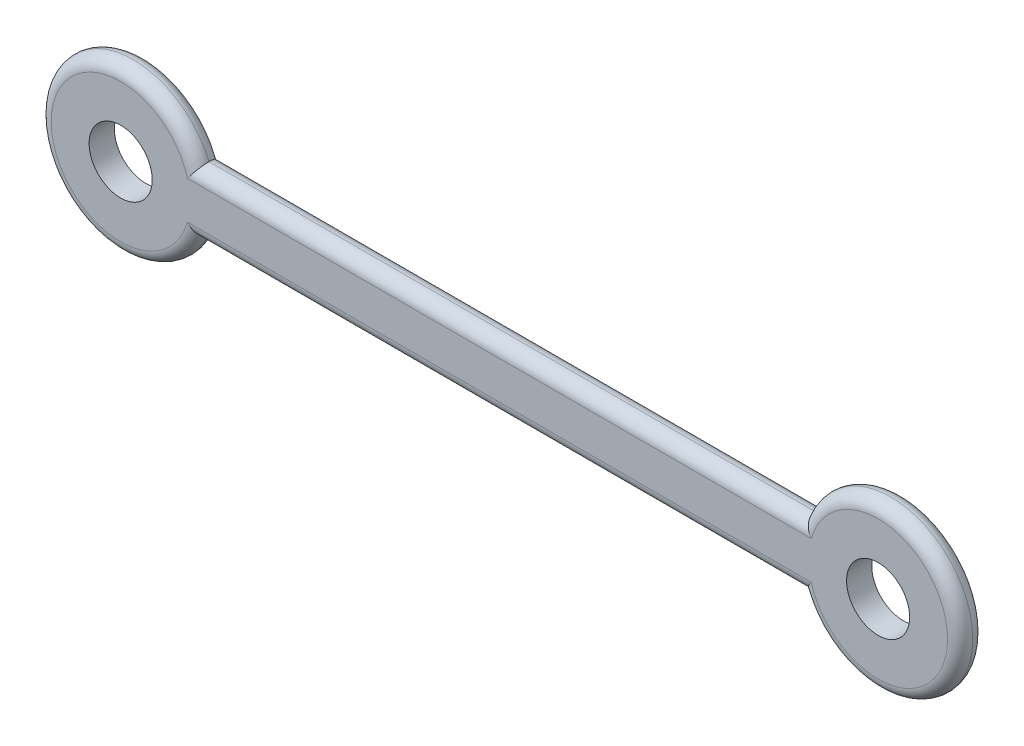
ISO-10303-21;
HEADER;
FILE_DESCRIPTION(('STEP AP214'),'2;1');
FILE_NAME('part.step','',(''),(''),'','','');
FILE_SCHEMA(('AUTOMOTIVE_DESIGN { 1 0 10303 214 1 1 1 1 }'));
ENDSEC;
DATA;
#1=APPLICATION_CONTEXT('core data for automotive mechanical design processes');
#2=APPLICATION_PROTOCOL_DEFINITION('international standard','automotive_design',2000,#1);
#3=PRODUCT_CONTEXT('',#1,'mechanical');
#4=PRODUCT('Part','Part','',(#3));
#5=PRODUCT_RELATED_PRODUCT_CATEGORY('part','',(#4));
#6=PRODUCT_DEFINITION_FORMATION('','',#4);
#7=PRODUCT_DEFINITION_CONTEXT('part definition',#1,'design');
#8=PRODUCT_DEFINITION('design','',#6,#7);
#9=PRODUCT_DEFINITION_SHAPE('','',#8);
#10=(LENGTH_UNIT() NAMED_UNIT(*) SI_UNIT(.MILLI.,.METRE.));
#11=(NAMED_UNIT(*) PLANE_ANGLE_UNIT() SI_UNIT($,.RADIAN.));
#12=(NAMED_UNIT(*) SI_UNIT($,.STERADIAN.) SOLID_ANGLE_UNIT());
#13=UNCERTAINTY_MEASURE_WITH_UNIT(LENGTH_MEASURE(1.E-05),#10,'distance_accuracy_value','');
#14=(GEOMETRIC_REPRESENTATION_CONTEXT(3) GLOBAL_UNCERTAINTY_ASSIGNED_CONTEXT((#13)) GLOBAL_UNIT_ASSIGNED_CONTEXT((#10,
#11,#12)) REPRESENTATION_CONTEXT('',''));
#15=CARTESIAN_POINT('',(0.,0.,0.));
#16=DIRECTION('',(0.,0.,1.));
#17=DIRECTION('',(1.,0.,0.));
#18=AXIS2_PLACEMENT_3D('',#15,#16,#17);
#19=CARTESIAN_POINT('',(152.4,0.,5.08));
#20=DIRECTION('',(0.,0.,1.));
#21=DIRECTION('',(1.,0.,0.));
#22=AXIS2_PLACEMENT_3D('',#19,#20,#21);
#23=PLANE('',#22);
#24=DIRECTION('',(-1.,0.,0.));
#25=VECTOR('',#24,1.);
#26=CARTESIAN_POINT('',(15.24,3.81,5.08));
#27=LINE('',#26,#25);
#28=CARTESIAN_POINT('',(138.959583339792,3.81,5.08));
#29=VERTEX_POINT('',#28);
#30=CARTESIAN_POINT('',(13.4404166602081,3.81,5.08));
#31=VERTEX_POINT('',#30);
#32=EDGE_CURVE('E117',#29,#31,#27,.T.);
#33=ORIENTED_EDGE('',*,*,#32,.T.);
#34=CARTESIAN_POINT('',(0.,0.,5.08));
#35=DIRECTION('',(0.,0.,1.));
#36=DIRECTION('',(1.,0.,0.));
#37=AXIS2_PLACEMENT_3D('',#34,#35,#36);
#38=CIRCLE('',#37,13.97);
#39=CARTESIAN_POINT('',(13.4404166602081,-3.81,5.08));
#40=VERTEX_POINT('',#39);
#41=EDGE_CURVE('E112',#31,#40,#38,.T.);
#42=ORIENTED_EDGE('',*,*,#41,.T.);
#43=DIRECTION('',(1.,0.,0.));
#44=VECTOR('',#43,1.);
#45=CARTESIAN_POINT('',(137.16,-3.81,5.08));
#46=LINE('',#45,#44);
#47=CARTESIAN_POINT('',(138.959583339792,-3.81,5.08));
#48=VERTEX_POINT('',#47);
#49=EDGE_CURVE('E106',#40,#48,#46,.T.);
#50=ORIENTED_EDGE('',*,*,#49,.T.);
#51=CARTESIAN_POINT('',(152.4,0.,5.08));
#52=DIRECTION('',(0.,0.,1.));
#53=DIRECTION('',(1.,0.,0.));
#54=AXIS2_PLACEMENT_3D('',#51,#52,#53);
#55=CIRCLE('',#54,13.97);
#56=EDGE_CURVE('E109',#48,#29,#55,.T.);
#57=ORIENTED_EDGE('',*,*,#56,.T.);
#58=EDGE_LOOP('',(#33,#42,#50,#57));
#59=FACE_BOUND('',#58,.T.);
#60=CARTESIAN_POINT('',(0.,0.,5.08));
#61=DIRECTION('',(0.,0.,1.));
#62=DIRECTION('',(1.,0.,0.));
#63=AXIS2_PLACEMENT_3D('',#60,#61,#62);
#64=CIRCLE('',#63,6.35);
#65=CARTESIAN_POINT('',(6.35,0.,5.08));
#66=VERTEX_POINT('',#65);
#67=EDGE_CURVE('E128',#66,#66,#64,.T.);
#68=ORIENTED_EDGE('',*,*,#67,.F.);
#69=EDGE_LOOP('',(#68));
#70=FACE_BOUND('',#69,.T.);
#71=CARTESIAN_POINT('',(152.4,0.,5.08));
#72=DIRECTION('',(0.,0.,1.));
#73=DIRECTION('',(1.,0.,0.));
#74=AXIS2_PLACEMENT_3D('',#71,#72,#73);
#75=CIRCLE('',#74,6.35);
#76=CARTESIAN_POINT('',(158.75,0.,5.08));
#77=VERTEX_POINT('',#76);
#78=EDGE_CURVE('E199',#77,#77,#75,.T.);
#79=ORIENTED_EDGE('',*,*,#78,.F.);
#80=EDGE_LOOP('',(#79));
#81=FACE_BOUND('',#80,.T.);
#82=ADVANCED_FACE('F45',(#59,#70,#81),#23,.T.);
#83=CARTESIAN_POINT('',(152.4,0.,0.));
#84=DIRECTION('',(0.,0.,1.));
#85=DIRECTION('',(1.,0.,0.));
#86=AXIS2_PLACEMENT_3D('',#83,#84,#85);
#87=PLANE('',#86);
#88=CARTESIAN_POINT('',(152.4,0.,0.));
#89=DIRECTION('',(0.,0.,1.));
#90=DIRECTION('',(1.,0.,0.));
#91=AXIS2_PLACEMENT_3D('',#88,#89,#90);
#92=CIRCLE('',#91,13.97);
#93=CARTESIAN_POINT('',(138.959583339792,3.81,0.));
#94=VERTEX_POINT('',#93);
#95=CARTESIAN_POINT('',(138.959583339792,-3.81,0.));
#96=VERTEX_POINT('',#95);
#97=EDGE_CURVE('E180',#94,#96,#92,.F.);
#98=ORIENTED_EDGE('',*,*,#97,.T.);
#99=DIRECTION('',(1.,0.,0.));
#100=VECTOR('',#99,1.);
#101=CARTESIAN_POINT('',(152.4,-3.81,0.));
#102=LINE('',#101,#100);
#103=CARTESIAN_POINT('',(13.4404166602081,-3.81,0.));
#104=VERTEX_POINT('',#103);
#105=EDGE_CURVE('E11',#96,#104,#102,.F.);
#106=ORIENTED_EDGE('',*,*,#105,.T.);
#107=CARTESIAN_POINT('',(0.,0.,0.));
#108=DIRECTION('',(0.,0.,1.));
#109=DIRECTION('',(1.,0.,0.));
#110=AXIS2_PLACEMENT_3D('',#107,#108,#109);
#111=CIRCLE('',#110,13.97);
#112=CARTESIAN_POINT('',(13.4404166602081,3.81,0.));
#113=VERTEX_POINT('',#112);
#114=EDGE_CURVE('E60',#104,#113,#111,.F.);
#115=ORIENTED_EDGE('',*,*,#114,.T.);
#116=DIRECTION('',(-1.,0.,0.));
#117=VECTOR('',#116,1.);
#118=CARTESIAN_POINT('',(152.4,3.81,0.));
#119=LINE('',#118,#117);
#120=EDGE_CURVE('E276',#113,#94,#119,.F.);
#121=ORIENTED_EDGE('',*,*,#120,.T.);
#122=EDGE_LOOP('',(#98,#106,#115,#121));
#123=FACE_BOUND('',#122,.T.);
#124=CARTESIAN_POINT('',(0.,0.,0.));
#125=DIRECTION('',(0.,0.,1.));
#126=DIRECTION('',(1.,0.,0.));
#127=AXIS2_PLACEMENT_3D('',#124,#125,#126);
#128=CIRCLE('',#127,6.35);
#129=CARTESIAN_POINT('',(6.35,0.,0.));
#130=VERTEX_POINT('',#129);
#131=EDGE_CURVE('E195',#130,#130,#128,.T.);
#132=ORIENTED_EDGE('',*,*,#131,.T.);
#133=EDGE_LOOP('',(#132));
#134=FACE_BOUND('',#133,.T.);
#135=CARTESIAN_POINT('',(152.4,0.,0.));
#136=DIRECTION('',(0.,0.,1.));
#137=DIRECTION('',(1.,0.,0.));
#138=AXIS2_PLACEMENT_3D('',#135,#136,#137);
#139=CIRCLE('',#138,6.35);
#140=CARTESIAN_POINT('',(158.75,0.,0.));
#141=VERTEX_POINT('',#140);
#142=EDGE_CURVE('E137',#141,#141,#139,.T.);
#143=ORIENTED_EDGE('',*,*,#142,.T.);
#144=EDGE_LOOP('',(#143));
#145=FACE_BOUND('',#144,.T.);
#146=ADVANCED_FACE('F166',(#123,#134,#145),#87,.F.);
#147=CARTESIAN_POINT('',(0.,0.,5.08));
#148=DIRECTION('',(0.,0.,-1.));
#149=DIRECTION('',(-1.,0.,0.));
#150=AXIS2_PLACEMENT_3D('',#147,#148,#149);
#151=CYLINDRICAL_SURFACE('',#150,6.35);
#152=ORIENTED_EDGE('',*,*,#67,.T.);
#153=EDGE_LOOP('',(#152));
#154=FACE_BOUND('',#153,.T.);
#155=ORIENTED_EDGE('',*,*,#131,.F.);
#156=EDGE_LOOP('',(#155));
#157=FACE_BOUND('',#156,.T.);
#158=ADVANCED_FACE('F218',(#154,#157),#151,.F.);
#159=CARTESIAN_POINT('',(152.4,0.,5.08));
#160=DIRECTION('',(0.,0.,-1.));
#161=DIRECTION('',(-1.,0.,0.));
#162=AXIS2_PLACEMENT_3D('',#159,#160,#161);
#163=CYLINDRICAL_SURFACE('',#162,6.35);
#164=ORIENTED_EDGE('',*,*,#78,.T.);
#165=EDGE_LOOP('',(#164));
#166=FACE_BOUND('',#165,.T.);
#167=ORIENTED_EDGE('',*,*,#142,.F.);
#168=EDGE_LOOP('',(#167));
#169=FACE_BOUND('',#168,.T.);
#170=ADVANCED_FACE('F210',(#166,#169),#163,.F.);
#171=CARTESIAN_POINT('',(152.4,0.,2.54));
#172=DIRECTION('',(0.,0.,1.));
#173=DIRECTION('',(1.,0.,0.));
#174=AXIS2_PLACEMENT_3D('',#171,#172,#173);
#175=TOROIDAL_SURFACE('',#174,13.97,2.54);
#176=CARTESIAN_POINT('',(137.16,-6.35,2.54));
#177=CARTESIAN_POINT('',(137.159993185477,-6.35001168540549,2.60270678433924));
#178=CARTESIAN_POINT('',(137.161547894436,-6.34767819352402,2.66540680352264));
#179=CARTESIAN_POINT('',(137.167727909472,-6.33841021761577,2.7902901794472));
#180=CARTESIAN_POINT('',(137.172352039431,-6.33147749588913,2.85247372485006));
#181=CARTESIAN_POINT('',(137.184588903405,-6.3131446679156,2.97557184710791));
#182=CARTESIAN_POINT('',(137.192187097852,-6.30176629599045,3.03649110168824));
#183=CARTESIAN_POINT('',(137.210269238345,-6.27471649906323,3.15691731527914));
#184=CARTESIAN_POINT('',(137.220753337122,-6.25904484684939,3.21642419936214));
#185=CARTESIAN_POINT('',(137.256333579799,-6.20592837686708,3.39207805653462));
#186=CARTESIAN_POINT('',(137.285583301847,-6.16234345136907,3.50561047736217));
#187=CARTESIAN_POINT('',(137.353902768269,-6.06093904194384,3.72292166758392));
#188=CARTESIAN_POINT('',(137.392982127627,-6.00310562181476,3.82669074948408));
#189=CARTESIAN_POINT('',(137.482065516217,-5.87190342957358,4.02843856455605));
#190=CARTESIAN_POINT('',(137.532570694546,-5.79782956572873,4.12573521460148));
#191=CARTESIAN_POINT('',(137.641359408467,-5.63921810964795,4.30636070522263));
#192=CARTESIAN_POINT('',(137.699645023904,-5.55467771996872,4.3896857974756));
#193=CARTESIAN_POINT('',(137.832208366426,-5.3636764984642,4.55393895227552));
#194=CARTESIAN_POINT('',(137.907558893384,-5.25586054609616,4.63242116824051));
#195=CARTESIAN_POINT('',(138.064750513866,-5.03285364898438,4.77012028297416));
#196=CARTESIAN_POINT('',(138.146598253282,-4.91765517660117,4.82931713085434));
#197=CARTESIAN_POINT('',(138.330385618462,-4.66134611695758,4.93781974613522));
#198=CARTESIAN_POINT('',(138.433273441832,-4.5193310657646,4.98337293777655));
#199=CARTESIAN_POINT('',(138.643247447485,-4.23285628598949,5.0488540210624));
#200=CARTESIAN_POINT('',(138.750327695908,-4.08840016620593,5.06881687125267));
#201=CARTESIAN_POINT('',(138.890008517562,-3.90222764760112,5.0786747704723));
#202=CARTESIAN_POINT('',(138.921660818973,-3.86018799632726,5.07985126738975));
#203=CARTESIAN_POINT('',(138.955452386106,-3.81546536934744,5.0799955884717));
#204=CARTESIAN_POINT('',(138.957517707597,-3.81273257595574,5.07999999787776));
#205=CARTESIAN_POINT('',(138.959583339792,-3.81,5.08));
#206=B_SPLINE_CURVE_WITH_KNOTS('',3,(#176,#177,#178,#179,#180,#181,#182,#183,#184,#185,#186,
#187,#188,#189,#190,#191,#192,#193,#194,#195,#196,#197,#198,#199,#200,#201,#202,#203,#204,#205),
.UNSPECIFIED.,.F.,.F.,(4,2,2,2,2,2,2,2,2,2,2,2,2,2,4),(0.,0.188046429546773,0.37602084638761,
0.56308754902683,0.750164153645137,1.12355787247731,1.49731826118258,1.89269723353259,
2.28818210996099,2.74597423325476,3.20424081263593,3.74578886131499,4.28659631893314,
4.4444811966348,4.4547575505659),.UNSPECIFIED.);
#207=CARTESIAN_POINT('',(137.16,-6.35,2.54));
#208=VERTEX_POINT('',#207);
#209=EDGE_CURVE('E122',#208,#48,#206,.T.);
#210=ORIENTED_EDGE('',*,*,#209,.F.);
#211=CARTESIAN_POINT('',(152.4,0.,2.54));
#212=DIRECTION('',(0.,0.,1.));
#213=DIRECTION('',(1.,0.,0.));
#214=AXIS2_PLACEMENT_3D('',#211,#212,#213);
#215=CIRCLE('',#214,16.51);
#216=CARTESIAN_POINT('',(137.16,6.35,2.54));
#217=VERTEX_POINT('',#216);
#218=EDGE_CURVE('E176',#217,#208,#215,.F.);
#219=ORIENTED_EDGE('',*,*,#218,.F.);
#220=CARTESIAN_POINT('',(137.16,6.35,2.54));
#221=CARTESIAN_POINT('',(137.159993185477,6.35001168540549,2.60270678433924));
#222=CARTESIAN_POINT('',(137.161547894436,6.34767819352402,2.66540680352264));
#223=CARTESIAN_POINT('',(137.167727909472,6.33841021761577,2.7902901794472));
#224=CARTESIAN_POINT('',(137.172352039431,6.33147749588913,2.85247372485006));
#225=CARTESIAN_POINT('',(137.184588903405,6.3131446679156,2.97557184710791));
#226=CARTESIAN_POINT('',(137.192187097852,6.30176629599045,3.03649110168824));
#227=CARTESIAN_POINT('',(137.210269238345,6.27471649906323,3.15691731527914));
#228=CARTESIAN_POINT('',(137.220753337122,6.25904484684939,3.21642419936214));
#229=CARTESIAN_POINT('',(137.256333579799,6.20592837686708,3.39207805653462));
#230=CARTESIAN_POINT('',(137.285583301847,6.16234345136907,3.50561047736217));
#231=CARTESIAN_POINT('',(137.353902768269,6.06093904194384,3.72292166758392));
#232=CARTESIAN_POINT('',(137.392982127627,6.00310562181476,3.82669074948408));
#233=CARTESIAN_POINT('',(137.482065516217,5.87190342957358,4.02843856455605));
#234=CARTESIAN_POINT('',(137.532570694546,5.79782956572873,4.12573521460148));
#235=CARTESIAN_POINT('',(137.641359408467,5.63921810964795,4.30636070522263));
#236=CARTESIAN_POINT('',(137.699645023904,5.55467771996872,4.3896857974756));
#237=CARTESIAN_POINT('',(137.832208366426,5.3636764984642,4.55393895227552));
#238=CARTESIAN_POINT('',(137.907558893384,5.25586054609616,4.63242116824051));
#239=CARTESIAN_POINT('',(138.064750513866,5.03285364898438,4.77012028297416));
#240=CARTESIAN_POINT('',(138.146598253282,4.91765517660117,4.82931713085434));
#241=CARTESIAN_POINT('',(138.330385618462,4.66134611695758,4.93781974613522));
#242=CARTESIAN_POINT('',(138.433273441832,4.5193310657646,4.98337293777655));
#243=CARTESIAN_POINT('',(138.643247447485,4.23285628598949,5.0488540210624));
#244=CARTESIAN_POINT('',(138.750327695908,4.08840016620593,5.06881687125267));
#245=CARTESIAN_POINT('',(138.890008517562,3.90222764760112,5.0786747704723));
#246=CARTESIAN_POINT('',(138.921660818973,3.86018799632726,5.07985126738975));
#247=CARTESIAN_POINT('',(138.955452386106,3.81546536934744,5.0799955884717));
#248=CARTESIAN_POINT('',(138.957517707597,3.81273257595574,5.07999999787776));
#249=CARTESIAN_POINT('',(138.959583339792,3.81,5.08));
#250=B_SPLINE_CURVE_WITH_KNOTS('',3,(#220,#221,#222,#223,#224,#225,#226,#227,#228,#229,#230,
#231,#232,#233,#234,#235,#236,#237,#238,#239,#240,#241,#242,#243,#244,#245,#246,#247,#248,#249),
.UNSPECIFIED.,.F.,.F.,(4,2,2,2,2,2,2,2,2,2,2,2,2,2,4),(0.,0.188046429546773,0.37602084638761,
0.56308754902683,0.750164153645137,1.12355787247731,1.49731826118258,1.89269723353259,
2.28818210996099,2.74597423325476,3.20424081263593,3.74578886131499,4.28659631893314,
4.4444811966348,4.4547575505659),.UNSPECIFIED.);
#251=EDGE_CURVE('E125',#29,#217,#250,.F.);
#252=ORIENTED_EDGE('',*,*,#251,.F.);
#253=ORIENTED_EDGE('',*,*,#56,.F.);
#254=EDGE_LOOP('',(#210,#219,#252,#253));
#255=FACE_BOUND('',#254,.T.);
#256=ADVANCED_FACE('F121',(#255),#175,.T.);
#257=CARTESIAN_POINT('',(152.4,3.81,2.54));
#258=DIRECTION('',(1.,0.,0.));
#259=DIRECTION('',(0.,0.,-1.));
#260=AXIS2_PLACEMENT_3D('',#257,#258,#259);
#261=CYLINDRICAL_SURFACE('',#260,2.54);
#262=ORIENTED_EDGE('',*,*,#251,.T.);
#263=DIRECTION('',(-1.,0.,0.));
#264=VECTOR('',#263,1.);
#265=CARTESIAN_POINT('',(137.16,6.35,2.54));
#266=LINE('',#265,#264);
#267=CARTESIAN_POINT('',(15.24,6.35,2.54));
#268=VERTEX_POINT('',#267);
#269=EDGE_CURVE('E181',#268,#217,#266,.F.);
#270=ORIENTED_EDGE('',*,*,#269,.F.);
#271=CARTESIAN_POINT('',(15.24,6.35,2.54));
#272=CARTESIAN_POINT('',(15.2400068145228,6.35001168540549,2.60270678433924));
#273=CARTESIAN_POINT('',(15.2384521055638,6.34767819352402,2.66540680352263));
#274=CARTESIAN_POINT('',(15.2322720905278,6.33841021761577,2.7902901794472));
#275=CARTESIAN_POINT('',(15.2276479605693,6.33147749588913,2.85247372485006));
#276=CARTESIAN_POINT('',(15.2154110965946,6.3131446679156,2.97557184710791));
#277=CARTESIAN_POINT('',(15.2078129021484,6.30176629599045,3.03649110168824));
#278=CARTESIAN_POINT('',(15.1897307616549,6.27471649906323,3.15691731527914));
#279=CARTESIAN_POINT('',(15.1792466628778,6.25904484684939,3.21642419936214));
#280=CARTESIAN_POINT('',(15.1436664202007,6.20592837686708,3.39207805653463));
#281=CARTESIAN_POINT('',(15.1144166981531,6.16234345136907,3.50561047736218));
#282=CARTESIAN_POINT('',(15.0460972317309,6.06093904194383,3.72292166758393));
#283=CARTESIAN_POINT('',(15.0070178723726,6.00310562181475,3.82669074948409));
#284=CARTESIAN_POINT('',(14.9179344837831,5.87190342957358,4.02843856455605));
#285=CARTESIAN_POINT('',(14.8674293054542,5.79782956572873,4.12573521460149));
#286=CARTESIAN_POINT('',(14.7586405915332,5.63921810964795,4.30636070522263));
#287=CARTESIAN_POINT('',(14.7003549760959,5.55467771996871,4.38968579747561));
#288=CARTESIAN_POINT('',(14.5677916335737,5.3636764984642,4.55393895227552));
#289=CARTESIAN_POINT('',(14.4924411066162,5.25586054609617,4.63242116824051));
#290=CARTESIAN_POINT('',(14.3352494861344,5.03285364898438,4.77012028297416));
#291=CARTESIAN_POINT('',(14.2534017467182,4.91765517660115,4.82931713085434));
#292=CARTESIAN_POINT('',(14.0696143815376,4.6613461169576,4.93781974613522));
#293=CARTESIAN_POINT('',(13.9667265581682,4.5193310657647,4.98337293777655));
#294=CARTESIAN_POINT('',(13.756752552515,4.23285628598937,5.0488540210624));
#295=CARTESIAN_POINT('',(13.6496723040923,4.0884001662055,5.06881687125266));
#296=CARTESIAN_POINT('',(13.5099914824374,3.90222764760123,5.0786747704723));
#297=CARTESIAN_POINT('',(13.4783391810262,3.86018799632755,5.07985126738975));
#298=CARTESIAN_POINT('',(13.4445476138937,3.81546536934747,5.0799955884717));
#299=CARTESIAN_POINT('',(13.4424822924029,3.81273257595576,5.07999999787776));
#300=CARTESIAN_POINT('',(13.4404166602081,3.81,5.08));
#301=B_SPLINE_CURVE_WITH_KNOTS('',3,(#271,#272,#273,#274,#275,#276,#277,#278,#279,#280,#281,
#282,#283,#284,#285,#286,#287,#288,#289,#290,#291,#292,#293,#294,#295,#296,#297,#298,#299,#300),
.UNSPECIFIED.,.F.,.F.,(4,2,2,2,2,2,2,2,2,2,2,2,2,2,4),(0.,0.188046429546772,0.376020846387612,
0.563087549026836,0.750164153645138,1.12355787247732,1.49731826118259,1.8926972335326,
2.28818210996099,2.74597423325476,3.20424081263594,3.74578886131501,4.28659631893314,
4.44448119663481,4.4547575505659),.UNSPECIFIED.);
#302=EDGE_CURVE('E133',#31,#268,#301,.F.);
#303=ORIENTED_EDGE('',*,*,#302,.F.);
#304=ORIENTED_EDGE('',*,*,#32,.F.);
#305=EDGE_LOOP('',(#262,#270,#303,#304));
#306=FACE_BOUND('',#305,.T.);
#307=ADVANCED_FACE('F165',(#306),#261,.T.);
#308=CARTESIAN_POINT('',(152.4,-3.81,2.54));
#309=DIRECTION('',(-1.,0.,0.));
#310=DIRECTION('',(0.,0.,1.));
#311=AXIS2_PLACEMENT_3D('',#308,#309,#310);
#312=CYLINDRICAL_SURFACE('',#311,2.54);
#313=ORIENTED_EDGE('',*,*,#209,.T.);
#314=ORIENTED_EDGE('',*,*,#49,.F.);
#315=CARTESIAN_POINT('',(15.24,-6.35000000000001,2.54));
#316=CARTESIAN_POINT('',(15.2400068145228,-6.35001168540549,2.60270678433924));
#317=CARTESIAN_POINT('',(15.2384521055638,-6.34767819352402,2.66540680352263));
#318=CARTESIAN_POINT('',(15.2322720905278,-6.33841021761577,2.7902901794472));
#319=CARTESIAN_POINT('',(15.2276479605693,-6.33147749588913,2.85247372485006));
#320=CARTESIAN_POINT('',(15.2154110965946,-6.3131446679156,2.97557184710791));
#321=CARTESIAN_POINT('',(15.2078129021484,-6.30176629599045,3.03649110168824));
#322=CARTESIAN_POINT('',(15.1897307616549,-6.27471649906323,3.15691731527914));
#323=CARTESIAN_POINT('',(15.1792466628778,-6.25904484684939,3.21642419936214));
#324=CARTESIAN_POINT('',(15.1436664202007,-6.20592837686708,3.39207805653463));
#325=CARTESIAN_POINT('',(15.1144166981531,-6.16234345136907,3.50561047736218));
#326=CARTESIAN_POINT('',(15.0460972317309,-6.06093904194383,3.72292166758392));
#327=CARTESIAN_POINT('',(15.0070178723726,-6.00310562181475,3.82669074948409));
#328=CARTESIAN_POINT('',(14.9179344837831,-5.87190342957358,4.02843856455605));
#329=CARTESIAN_POINT('',(14.8674293054542,-5.79782956572873,4.12573521460149));
#330=CARTESIAN_POINT('',(14.7586405915332,-5.63921810964795,4.30636070522263));
#331=CARTESIAN_POINT('',(14.7003549760959,-5.55467771996871,4.38968579747561));
#332=CARTESIAN_POINT('',(14.5677916335737,-5.3636764984642,4.55393895227552));
#333=CARTESIAN_POINT('',(14.4924411066162,-5.25586054609617,4.63242116824051));
#334=CARTESIAN_POINT('',(14.3352494861344,-5.03285364898438,4.77012028297416));
#335=CARTESIAN_POINT('',(14.2534017467182,-4.91765517660115,4.82931713085434));
#336=CARTESIAN_POINT('',(14.0696143815376,-4.6613461169576,4.93781974613522));
#337=CARTESIAN_POINT('',(13.9667265581682,-4.5193310657647,4.98337293777655));
#338=CARTESIAN_POINT('',(13.756752552515,-4.23285628598937,5.0488540210624));
#339=CARTESIAN_POINT('',(13.6496723040923,-4.0884001662055,5.06881687125266));
#340=CARTESIAN_POINT('',(13.5099914824374,-3.90222764760123,5.0786747704723));
#341=CARTESIAN_POINT('',(13.4783391810262,-3.86018799632755,5.07985126738975));
#342=CARTESIAN_POINT('',(13.4445476138937,-3.81546536934747,5.0799955884717));
#343=CARTESIAN_POINT('',(13.4424822924029,-3.81273257595576,5.07999999787776));
#344=CARTESIAN_POINT('',(13.4404166602081,-3.81,5.08));
#345=B_SPLINE_CURVE_WITH_KNOTS('',3,(#315,#316,#317,#318,#319,#320,#321,#322,#323,#324,#325,
#326,#327,#328,#329,#330,#331,#332,#333,#334,#335,#336,#337,#338,#339,#340,#341,#342,#343,#344),
.UNSPECIFIED.,.F.,.F.,(4,2,2,2,2,2,2,2,2,2,2,2,2,2,4),(0.,0.188046429546772,0.376020846387611,
0.563087549026836,0.750164153645138,1.12355787247732,1.49731826118259,1.89269723353259,
2.288182109961,2.74597423325476,3.20424081263594,3.74578886131501,4.28659631893314,
4.44448119663481,4.4547575505659),.UNSPECIFIED.);
#346=CARTESIAN_POINT('',(15.24,-6.35000000000001,2.54));
#347=VERTEX_POINT('',#346);
#348=EDGE_CURVE('E139',#347,#40,#345,.T.);
#349=ORIENTED_EDGE('',*,*,#348,.F.);
#350=DIRECTION('',(1.,0.,0.));
#351=VECTOR('',#350,1.);
#352=CARTESIAN_POINT('',(15.24,-6.35,2.54));
#353=LINE('',#352,#351);
#354=EDGE_CURVE('E131',#208,#347,#353,.F.);
#355=ORIENTED_EDGE('',*,*,#354,.F.);
#356=EDGE_LOOP('',(#313,#314,#349,#355));
#357=FACE_BOUND('',#356,.T.);
#358=ADVANCED_FACE('F130',(#357),#312,.T.);
#359=CARTESIAN_POINT('',(0.,0.,2.54));
#360=DIRECTION('',(0.,0.,1.));
#361=DIRECTION('',(1.,0.,0.));
#362=AXIS2_PLACEMENT_3D('',#359,#360,#361);
#363=TOROIDAL_SURFACE('',#362,13.97,2.54);
#364=ORIENTED_EDGE('',*,*,#302,.T.);
#365=CARTESIAN_POINT('',(0.,0.,2.54));
#366=DIRECTION('',(0.,0.,1.));
#367=DIRECTION('',(1.,0.,0.));
#368=AXIS2_PLACEMENT_3D('',#365,#366,#367);
#369=CIRCLE('',#368,16.51);
#370=EDGE_CURVE('E187',#347,#268,#369,.F.);
#371=ORIENTED_EDGE('',*,*,#370,.F.);
#372=ORIENTED_EDGE('',*,*,#348,.T.);
#373=ORIENTED_EDGE('',*,*,#41,.F.);
#374=EDGE_LOOP('',(#364,#371,#372,#373));
#375=FACE_BOUND('',#374,.T.);
#376=ADVANCED_FACE('F164',(#375),#363,.T.);
#377=CARTESIAN_POINT('',(15.24,3.81,2.54));
#378=DIRECTION('',(-1.,0.,0.));
#379=DIRECTION('',(0.,0.,1.));
#380=AXIS2_PLACEMENT_3D('',#377,#378,#379);
#381=CYLINDRICAL_SURFACE('',#380,2.54);
#382=CARTESIAN_POINT('',(137.16,6.35,2.54));
#383=CARTESIAN_POINT('',(137.159993185477,6.35001168540549,2.47729321566076));
#384=CARTESIAN_POINT('',(137.161547894436,6.34767819352402,2.41459319647737));
#385=CARTESIAN_POINT('',(137.167727909472,6.33841021761577,2.2897098205528));
#386=CARTESIAN_POINT('',(137.172352039431,6.33147749588913,2.22752627514994));
#387=CARTESIAN_POINT('',(137.184588903405,6.3131446679156,2.10442815289209));
#388=CARTESIAN_POINT('',(137.192187097852,6.30176629599045,2.04350889831176));
#389=CARTESIAN_POINT('',(137.210269238345,6.27471649906323,1.92308268472086));
#390=CARTESIAN_POINT('',(137.220753337122,6.25904484684939,1.86357580063786));
#391=CARTESIAN_POINT('',(137.256333579799,6.20592837686708,1.68792194346538));
#392=CARTESIAN_POINT('',(137.285583301847,6.16234345136907,1.57438952263783));
#393=CARTESIAN_POINT('',(137.353902768269,6.06093904194383,1.35707833241608));
#394=CARTESIAN_POINT('',(137.392982127627,6.00310562181475,1.25330925051591));
#395=CARTESIAN_POINT('',(137.482065516217,5.87190342957358,1.05156143544395));
#396=CARTESIAN_POINT('',(137.532570694546,5.79782956572873,0.954264785398517));
#397=CARTESIAN_POINT('',(137.641359408467,5.63921810964796,0.773639294777369));
#398=CARTESIAN_POINT('',(137.699645023904,5.55467771996872,0.690314202524396));
#399=CARTESIAN_POINT('',(137.832208366426,5.3636764984642,0.52606104772448));
#400=CARTESIAN_POINT('',(137.907558893384,5.25586054609616,0.447578831759491));
#401=CARTESIAN_POINT('',(138.064750513866,5.03285364898438,0.309879717025837));
#402=CARTESIAN_POINT('',(138.146598253282,4.91765517660117,0.250682869145661));
#403=CARTESIAN_POINT('',(138.330385618462,4.66134611695758,0.142180253864782));
#404=CARTESIAN_POINT('',(138.433273441832,4.5193310657646,0.096627062223453));
#405=CARTESIAN_POINT('',(138.643247447485,4.23285628598949,0.0311459789376054));
#406=CARTESIAN_POINT('',(138.750327695908,4.08840016620593,0.0111831287473333));
#407=CARTESIAN_POINT('',(138.890008517562,3.90222764760112,0.00132522952770404));
#408=CARTESIAN_POINT('',(138.921660818973,3.86018799632726,0.000148732610251243));
#409=CARTESIAN_POINT('',(138.955452386106,3.81546536934744,4.41152829775952E-06));
#410=CARTESIAN_POINT('',(138.957517707597,3.81273257595574,2.12224008108299E-09));
#411=CARTESIAN_POINT('',(138.959583339792,3.81,0.));
#412=B_SPLINE_CURVE_WITH_KNOTS('',3,(#382,#383,#384,#385,#386,#387,#388,#389,#390,#391,#392,
#393,#394,#395,#396,#397,#398,#399,#400,#401,#402,#403,#404,#405,#406,#407,#408,#409,#410,#411),
.UNSPECIFIED.,.F.,.F.,(4,2,2,2,2,2,2,2,2,2,2,2,2,2,4),(0.,0.188046429546771,0.376020846387609,
0.563087549026833,0.750164153645136,1.12355787247732,1.49731826118258,1.89269723353259,
2.28818210996099,2.74597423325477,3.20424081263593,3.74578886131499,4.28659631893314,
4.4444811966348,4.4547575505659),.UNSPECIFIED.);
#413=EDGE_CURVE('E240',#94,#217,#412,.F.);
#414=ORIENTED_EDGE('',*,*,#413,.F.);
#415=ORIENTED_EDGE('',*,*,#120,.F.);
#416=CARTESIAN_POINT('',(15.24,6.35,2.54));
#417=CARTESIAN_POINT('',(15.2400068145228,6.35001168540549,2.47729321566076));
#418=CARTESIAN_POINT('',(15.2384521055638,6.34767819352402,2.41459319647737));
#419=CARTESIAN_POINT('',(15.2322720905278,6.33841021761577,2.2897098205528));
#420=CARTESIAN_POINT('',(15.2276479605693,6.33147749588913,2.22752627514994));
#421=CARTESIAN_POINT('',(15.2154110965946,6.3131446679156,2.10442815289209));
#422=CARTESIAN_POINT('',(15.2078129021484,6.30176629599045,2.04350889831176));
#423=CARTESIAN_POINT('',(15.1897307616549,6.27471649906323,1.92308268472086));
#424=CARTESIAN_POINT('',(15.1792466628778,6.25904484684939,1.86357580063786));
#425=CARTESIAN_POINT('',(15.1436664202007,6.20592837686708,1.68792194346537));
#426=CARTESIAN_POINT('',(15.1144166981531,6.16234345136907,1.57438952263782));
#427=CARTESIAN_POINT('',(15.0460972317309,6.06093904194383,1.35707833241607));
#428=CARTESIAN_POINT('',(15.0070178723726,6.00310562181475,1.25330925051591));
#429=CARTESIAN_POINT('',(14.9179344837831,5.87190342957358,1.05156143544395));
#430=CARTESIAN_POINT('',(14.8674293054542,5.79782956572873,0.954264785398516));
#431=CARTESIAN_POINT('',(14.7586405915332,5.63921810964796,0.77363929477737));
#432=CARTESIAN_POINT('',(14.7003549760959,5.55467771996872,0.690314202524395));
#433=CARTESIAN_POINT('',(14.5677916335737,5.3636764984642,0.52606104772448));
#434=CARTESIAN_POINT('',(14.4924411066162,5.25586054609616,0.447578831759492));
#435=CARTESIAN_POINT('',(14.3352494861344,5.03285364898438,0.309879717025838));
#436=CARTESIAN_POINT('',(14.2534017467181,4.91765517660118,0.25068286914566));
#437=CARTESIAN_POINT('',(14.0696143815377,4.66134611695757,0.142180253864779));
#438=CARTESIAN_POINT('',(13.9667265581684,4.51933106576458,0.0966270622234513));
#439=CARTESIAN_POINT('',(13.7567525525148,4.23285628598949,0.0311459789376046));
#440=CARTESIAN_POINT('',(13.6496723040917,4.08840016620595,0.0111831287473322));
#441=CARTESIAN_POINT('',(13.5099914824376,3.90222764760111,0.00132522952770331));
#442=CARTESIAN_POINT('',(13.4783391810267,3.86018799632723,0.000148732610250666));
#443=CARTESIAN_POINT('',(13.4445476138938,3.81546536934743,4.41152829769913E-06));
#444=CARTESIAN_POINT('',(13.442482292403,3.81273257595574,2.12224005329457E-09));
#445=CARTESIAN_POINT('',(13.4404166602081,3.81,0.));
#446=B_SPLINE_CURVE_WITH_KNOTS('',3,(#416,#417,#418,#419,#420,#421,#422,#423,#424,#425,#426,
#427,#428,#429,#430,#431,#432,#433,#434,#435,#436,#437,#438,#439,#440,#441,#442,#443,#444,#445),
.UNSPECIFIED.,.F.,.F.,(4,2,2,2,2,2,2,2,2,2,2,2,2,2,4),(0.,0.188046429546772,0.376020846387611,
0.563087549026837,0.750164153645138,1.12355787247732,1.49731826118259,1.89269723353259,
2.288182109961,2.74597423325476,3.20424081263594,3.745788861315,4.28659631893314,
4.44448119663481,4.4547575505659),.UNSPECIFIED.);
#447=EDGE_CURVE('E50',#268,#113,#446,.T.);
#448=ORIENTED_EDGE('',*,*,#447,.F.);
#449=ORIENTED_EDGE('',*,*,#269,.T.);
#450=EDGE_LOOP('',(#414,#415,#448,#449));
#451=FACE_BOUND('',#450,.T.);
#452=ADVANCED_FACE('F47',(#451),#381,.T.);
#453=CARTESIAN_POINT('',(0.,0.,2.54));
#454=DIRECTION('',(0.,0.,1.));
#455=DIRECTION('',(1.,0.,0.));
#456=AXIS2_PLACEMENT_3D('',#453,#454,#455);
#457=TOROIDAL_SURFACE('',#456,13.97,2.54);
#458=ORIENTED_EDGE('',*,*,#447,.T.);
#459=ORIENTED_EDGE('',*,*,#114,.F.);
#460=CARTESIAN_POINT('',(15.24,-6.35,2.54));
#461=CARTESIAN_POINT('',(15.2400068145228,-6.35001168540549,2.47729321566076));
#462=CARTESIAN_POINT('',(15.2384521055638,-6.34767819352402,2.41459319647737));
#463=CARTESIAN_POINT('',(15.2322720905278,-6.33841021761577,2.2897098205528));
#464=CARTESIAN_POINT('',(15.2276479605693,-6.33147749588913,2.22752627514994));
#465=CARTESIAN_POINT('',(15.2154110965946,-6.3131446679156,2.10442815289209));
#466=CARTESIAN_POINT('',(15.2078129021484,-6.30176629599045,2.04350889831176));
#467=CARTESIAN_POINT('',(15.1897307616549,-6.27471649906323,1.92308268472086));
#468=CARTESIAN_POINT('',(15.1792466628778,-6.25904484684939,1.86357580063786));
#469=CARTESIAN_POINT('',(15.1436664202007,-6.20592837686708,1.68792194346537));
#470=CARTESIAN_POINT('',(15.1144166981531,-6.16234345136907,1.57438952263782));
#471=CARTESIAN_POINT('',(15.0460972317309,-6.06093904194383,1.35707833241607));
#472=CARTESIAN_POINT('',(15.0070178723726,-6.00310562181475,1.25330925051591));
#473=CARTESIAN_POINT('',(14.9179344837831,-5.87190342957358,1.05156143544395));
#474=CARTESIAN_POINT('',(14.8674293054542,-5.79782956572873,0.954264785398514));
#475=CARTESIAN_POINT('',(14.7586405915332,-5.63921810964795,0.773639294777369));
#476=CARTESIAN_POINT('',(14.7003549760959,-5.55467771996871,0.690314202524395));
#477=CARTESIAN_POINT('',(14.5677916335737,-5.3636764984642,0.526061047724481));
#478=CARTESIAN_POINT('',(14.4924411066162,-5.25586054609617,0.447578831759494));
#479=CARTESIAN_POINT('',(14.3352494861344,-5.03285364898438,0.30987971702584));
#480=CARTESIAN_POINT('',(14.2534017467182,-4.91765517660115,0.250682869145661));
#481=CARTESIAN_POINT('',(14.0696143815376,-4.6613461169576,0.142180253864778));
#482=CARTESIAN_POINT('',(13.9667265581682,-4.5193310657647,0.0966270622234495));
#483=CARTESIAN_POINT('',(13.756752552515,-4.23285628598936,0.0311459789376042));
#484=CARTESIAN_POINT('',(13.6496723040924,-4.08840016620548,0.0111831287473331));
#485=CARTESIAN_POINT('',(13.5099914824374,-3.90222764760124,0.00132522952770333));
#486=CARTESIAN_POINT('',(13.4783391810262,-3.86018799632757,0.000148732610250326));
#487=CARTESIAN_POINT('',(13.4445476138937,-3.81546536934748,4.41152829765423E-06));
#488=CARTESIAN_POINT('',(13.4424822924029,-3.81273257595576,2.12224002911982E-09));
#489=CARTESIAN_POINT('',(13.4404166602081,-3.81,0.));
#490=B_SPLINE_CURVE_WITH_KNOTS('',3,(#460,#461,#462,#463,#464,#465,#466,#467,#468,#469,#470,
#471,#472,#473,#474,#475,#476,#477,#478,#479,#480,#481,#482,#483,#484,#485,#486,#487,#488,#489),
.UNSPECIFIED.,.F.,.F.,(4,2,2,2,2,2,2,2,2,2,2,2,2,2,4),(0.,0.188046429546772,0.376020846387611,
0.563087549026835,0.750164153645138,1.12355787247732,1.49731826118259,1.8926972335326,
2.28818210996099,2.74597423325476,3.20424081263594,3.74578886131501,4.28659631893314,
4.44448119663481,4.4547575505659),.UNSPECIFIED.);
#491=EDGE_CURVE('E68',#347,#104,#490,.T.);
#492=ORIENTED_EDGE('',*,*,#491,.F.);
#493=ORIENTED_EDGE('',*,*,#370,.T.);
#494=EDGE_LOOP('',(#458,#459,#492,#493));
#495=FACE_BOUND('',#494,.T.);
#496=ADVANCED_FACE('F264',(#495),#457,.T.);
#497=CARTESIAN_POINT('',(152.4,0.,2.54));
#498=DIRECTION('',(0.,0.,1.));
#499=DIRECTION('',(1.,0.,0.));
#500=AXIS2_PLACEMENT_3D('',#497,#498,#499);
#501=TOROIDAL_SURFACE('',#500,13.97,2.54);
#502=ORIENTED_EDGE('',*,*,#413,.T.);
#503=ORIENTED_EDGE('',*,*,#218,.T.);
#504=CARTESIAN_POINT('',(137.16,-6.35,2.54));
#505=CARTESIAN_POINT('',(137.159993185477,-6.35001168540549,2.47729321566076));
#506=CARTESIAN_POINT('',(137.161547894436,-6.34767819352402,2.41459319647737));
#507=CARTESIAN_POINT('',(137.167727909472,-6.33841021761577,2.2897098205528));
#508=CARTESIAN_POINT('',(137.172352039431,-6.33147749588913,2.22752627514994));
#509=CARTESIAN_POINT('',(137.184588903405,-6.3131446679156,2.10442815289209));
#510=CARTESIAN_POINT('',(137.192187097852,-6.30176629599045,2.04350889831176));
#511=CARTESIAN_POINT('',(137.210269238345,-6.27471649906323,1.92308268472086));
#512=CARTESIAN_POINT('',(137.220753337122,-6.25904484684939,1.86357580063786));
#513=CARTESIAN_POINT('',(137.256333579799,-6.20592837686708,1.68792194346538));
#514=CARTESIAN_POINT('',(137.285583301847,-6.16234345136907,1.57438952263783));
#515=CARTESIAN_POINT('',(137.353902768269,-6.06093904194383,1.35707833241608));
#516=CARTESIAN_POINT('',(137.392982127627,-6.00310562181475,1.25330925051591));
#517=CARTESIAN_POINT('',(137.482065516217,-5.87190342957358,1.05156143544395));
#518=CARTESIAN_POINT('',(137.532570694546,-5.79782956572873,0.954264785398517));
#519=CARTESIAN_POINT('',(137.641359408467,-5.63921810964796,0.773639294777369));
#520=CARTESIAN_POINT('',(137.699645023904,-5.55467771996872,0.690314202524396));
#521=CARTESIAN_POINT('',(137.832208366426,-5.3636764984642,0.52606104772448));
#522=CARTESIAN_POINT('',(137.907558893384,-5.25586054609616,0.447578831759491));
#523=CARTESIAN_POINT('',(138.064750513866,-5.03285364898438,0.309879717025837));
#524=CARTESIAN_POINT('',(138.146598253282,-4.91765517660117,0.250682869145661));
#525=CARTESIAN_POINT('',(138.330385618462,-4.66134611695758,0.142180253864782));
#526=CARTESIAN_POINT('',(138.433273441832,-4.5193310657646,0.096627062223453));
#527=CARTESIAN_POINT('',(138.643247447485,-4.23285628598949,0.0311459789376054));
#528=CARTESIAN_POINT('',(138.750327695908,-4.08840016620593,0.0111831287473333));
#529=CARTESIAN_POINT('',(138.890008517562,-3.90222764760112,0.00132522952770404));
#530=CARTESIAN_POINT('',(138.921660818973,-3.86018799632726,0.000148732610251243));
#531=CARTESIAN_POINT('',(138.955452386106,-3.81546536934744,4.41152829775952E-06));
#532=CARTESIAN_POINT('',(138.957517707597,-3.81273257595574,2.12224008108299E-09));
#533=CARTESIAN_POINT('',(138.959583339792,-3.81,0.));
#534=B_SPLINE_CURVE_WITH_KNOTS('',3,(#504,#505,#506,#507,#508,#509,#510,#511,#512,#513,#514,
#515,#516,#517,#518,#519,#520,#521,#522,#523,#524,#525,#526,#527,#528,#529,#530,#531,#532,#533),
.UNSPECIFIED.,.F.,.F.,(4,2,2,2,2,2,2,2,2,2,2,2,2,2,4),(0.,0.188046429546771,0.376020846387609,
0.563087549026833,0.750164153645136,1.12355787247732,1.49731826118258,1.89269723353259,
2.28818210996099,2.74597423325477,3.20424081263593,3.74578886131499,4.28659631893314,
4.4444811966348,4.4547575505659),.UNSPECIFIED.);
#535=EDGE_CURVE('E249',#96,#208,#534,.F.);
#536=ORIENTED_EDGE('',*,*,#535,.F.);
#537=ORIENTED_EDGE('',*,*,#97,.F.);
#538=EDGE_LOOP('',(#502,#503,#536,#537));
#539=FACE_BOUND('',#538,.T.);
#540=ADVANCED_FACE('F244',(#539),#501,.T.);
#541=CARTESIAN_POINT('',(15.24,-3.81,2.54));
#542=DIRECTION('',(1.,0.,0.));
#543=DIRECTION('',(0.,0.,-1.));
#544=AXIS2_PLACEMENT_3D('',#541,#542,#543);
#545=CYLINDRICAL_SURFACE('',#544,2.54);
#546=ORIENTED_EDGE('',*,*,#491,.T.);
#547=ORIENTED_EDGE('',*,*,#105,.F.);
#548=ORIENTED_EDGE('',*,*,#535,.T.);
#549=ORIENTED_EDGE('',*,*,#354,.T.);
#550=EDGE_LOOP('',(#546,#547,#548,#549));
#551=FACE_BOUND('',#550,.T.);
#552=ADVANCED_FACE('F263',(#551),#545,.T.);
#553=CLOSED_SHELL('',(#82,#146,#158,#170,#256,#307,#358,#376,#452,#496,#540,#552));
#554=MANIFOLD_SOLID_BREP('B2',#553);
#555=ADVANCED_BREP_SHAPE_REPRESENTATION('',(#18,#554),#14);
#556=SHAPE_DEFINITION_REPRESENTATION(#9,#555);
ENDSEC;
END-ISO-10303-21;
